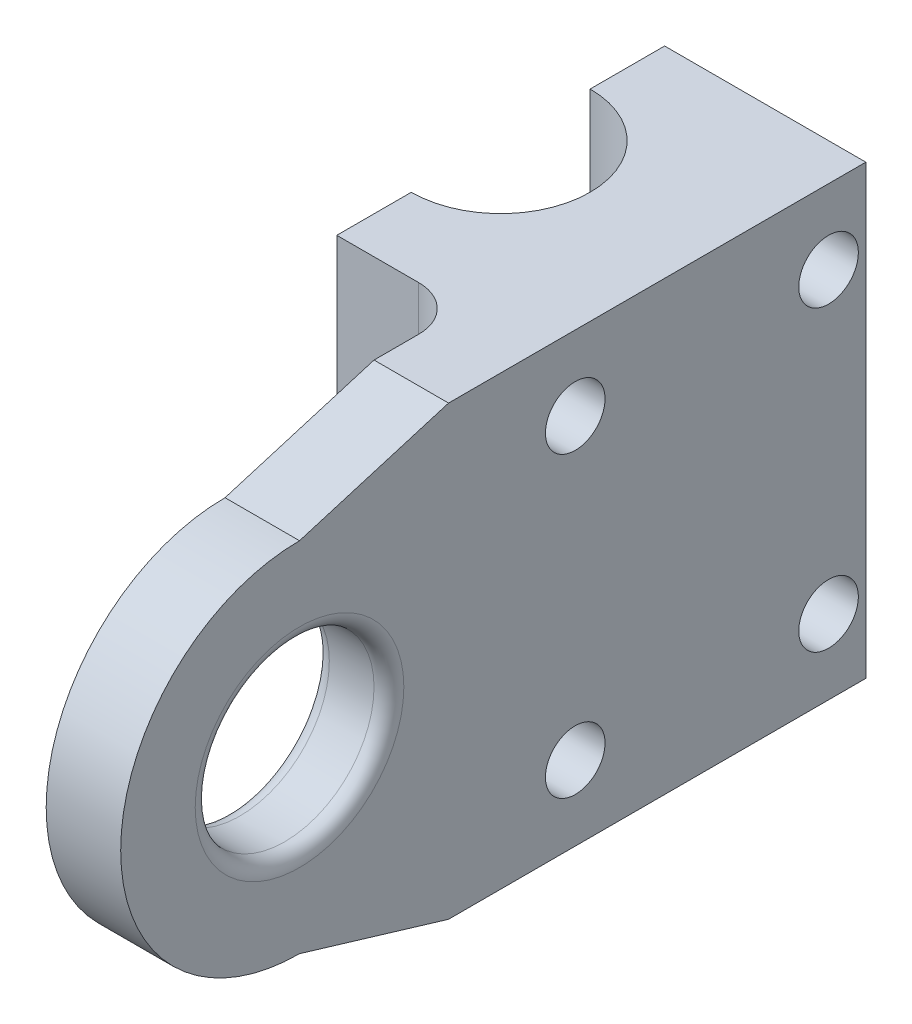
ISO-10303-21;
HEADER;
FILE_DESCRIPTION(('STEP AP214'),'2;1');
FILE_NAME('part.step','',(''),(''),'','','');
FILE_SCHEMA(('AUTOMOTIVE_DESIGN { 1 0 10303 214 1 1 1 1 }'));
ENDSEC;
DATA;
#1=APPLICATION_CONTEXT('core data for automotive mechanical design processes');
#2=APPLICATION_PROTOCOL_DEFINITION('international standard','automotive_design',2000,#1);
#3=PRODUCT_CONTEXT('',#1,'mechanical');
#4=PRODUCT('Part','Part','',(#3));
#5=PRODUCT_RELATED_PRODUCT_CATEGORY('part','',(#4));
#6=PRODUCT_DEFINITION_FORMATION('','',#4);
#7=PRODUCT_DEFINITION_CONTEXT('part definition',#1,'design');
#8=PRODUCT_DEFINITION('design','',#6,#7);
#9=PRODUCT_DEFINITION_SHAPE('','',#8);
#10=(LENGTH_UNIT() NAMED_UNIT(*) SI_UNIT(.MILLI.,.METRE.));
#11=(NAMED_UNIT(*) PLANE_ANGLE_UNIT() SI_UNIT($,.RADIAN.));
#12=(NAMED_UNIT(*) SI_UNIT($,.STERADIAN.) SOLID_ANGLE_UNIT());
#13=UNCERTAINTY_MEASURE_WITH_UNIT(LENGTH_MEASURE(1.E-05),#10,'distance_accuracy_value','');
#14=(GEOMETRIC_REPRESENTATION_CONTEXT(3) GLOBAL_UNCERTAINTY_ASSIGNED_CONTEXT((#13)) GLOBAL_UNIT_ASSIGNED_CONTEXT((#10,
#11,#12)) REPRESENTATION_CONTEXT('',''));
#15=CARTESIAN_POINT('',(0.,0.,0.));
#16=DIRECTION('',(0.,0.,1.));
#17=DIRECTION('',(1.,0.,0.));
#18=AXIS2_PLACEMENT_3D('',#15,#16,#17);
#19=CARTESIAN_POINT('',(8.5,30.,0.));
#20=DIRECTION('',(1.,0.,0.));
#21=DIRECTION('',(0.,0.,-1.));
#22=AXIS2_PLACEMENT_3D('',#19,#20,#21);
#23=PLANE('',#22);
#24=CARTESIAN_POINT('',(8.5,15.,-12.));
#25=DIRECTION('',(1.,0.,0.));
#26=DIRECTION('',(0.,0.,-1.));
#27=AXIS2_PLACEMENT_3D('',#24,#25,#26);
#28=CIRCLE('',#27,7.);
#29=CARTESIAN_POINT('',(8.5,15.,-19.));
#30=VERTEX_POINT('',#29);
#31=EDGE_CURVE('E12',#30,#30,#28,.T.);
#32=ORIENTED_EDGE('',*,*,#31,.T.);
#33=EDGE_LOOP('',(#32));
#34=FACE_BOUND('',#33,.T.);
#35=CARTESIAN_POINT('',(8.5,15.,-12.));
#36=DIRECTION('',(1.,0.,0.));
#37=DIRECTION('',(0.,0.,-1.));
#38=AXIS2_PLACEMENT_3D('',#35,#36,#37);
#39=CIRCLE('',#38,12.);
#40=CARTESIAN_POINT('',(8.5,3.,-12.));
#41=VERTEX_POINT('',#40);
#42=CARTESIAN_POINT('',(8.5,27.,-12.));
#43=VERTEX_POINT('',#42);
#44=EDGE_CURVE('E334',#41,#43,#39,.F.);
#45=ORIENTED_EDGE('',*,*,#44,.T.);
#46=DIRECTION('',(0.,-0.287347885566346,0.957826285221151));
#47=VECTOR('',#46,1.);
#48=CARTESIAN_POINT('',(8.5,21.4678899082569,6.44036697247707));
#49=LINE('',#48,#47);
#50=CARTESIAN_POINT('',(8.5,30.,-22.));
#51=VERTEX_POINT('',#50);
#52=EDGE_CURVE('E202',#51,#43,#49,.T.);
#53=ORIENTED_EDGE('',*,*,#52,.F.);
#54=DIRECTION('',(0.,0.,1.));
#55=VECTOR('',#54,1.);
#56=CARTESIAN_POINT('',(8.5,30.,0.));
#57=LINE('',#56,#55);
#58=CARTESIAN_POINT('',(8.5,30.,-25.));
#59=VERTEX_POINT('',#58);
#60=EDGE_CURVE('E181',#59,#51,#57,.T.);
#61=ORIENTED_EDGE('',*,*,#60,.F.);
#62=DIRECTION('',(0.,-1.,0.));
#63=VECTOR('',#62,1.);
#64=CARTESIAN_POINT('',(8.5,30.,-25.));
#65=LINE('',#64,#63);
#66=CARTESIAN_POINT('',(8.5,0.,-25.));
#67=VERTEX_POINT('',#66);
#68=EDGE_CURVE('E189',#59,#67,#65,.T.);
#69=ORIENTED_EDGE('',*,*,#68,.T.);
#70=DIRECTION('',(0.,0.,1.));
#71=VECTOR('',#70,1.);
#72=CARTESIAN_POINT('',(8.5,0.,0.));
#73=LINE('',#72,#71);
#74=CARTESIAN_POINT('',(8.5,0.,-22.));
#75=VERTEX_POINT('',#74);
#76=EDGE_CURVE('E221',#67,#75,#73,.T.);
#77=ORIENTED_EDGE('',*,*,#76,.T.);
#78=DIRECTION('',(0.,-0.287347885566346,-0.957826285221151));
#79=VECTOR('',#78,1.);
#80=CARTESIAN_POINT('',(8.5,6.05504587155964,-1.81651376146789));
#81=LINE('',#80,#79);
#82=EDGE_CURVE('E114',#41,#75,#81,.T.);
#83=ORIENTED_EDGE('',*,*,#82,.F.);
#84=EDGE_LOOP('',(#45,#53,#61,#69,#77,#83));
#85=FACE_BOUND('',#84,.T.);
#86=ADVANCED_FACE('F99',(#34,#85),#23,.F.);
#87=CARTESIAN_POINT('',(13.5,30.,-50.));
#88=DIRECTION('',(-1.,0.,0.));
#89=DIRECTION('',(0.,0.,1.));
#90=AXIS2_PLACEMENT_3D('',#87,#88,#89);
#91=PLANE('',#90);
#92=CARTESIAN_POINT('',(13.5,15.,-12.));
#93=DIRECTION('',(-1.,0.,0.));
#94=DIRECTION('',(0.,0.,1.));
#95=AXIS2_PLACEMENT_3D('',#92,#93,#94);
#96=CIRCLE('',#95,7.);
#97=CARTESIAN_POINT('',(13.5,15.,-5.));
#98=VERTEX_POINT('',#97);
#99=EDGE_CURVE('E107',#98,#98,#96,.T.);
#100=ORIENTED_EDGE('',*,*,#99,.T.);
#101=EDGE_LOOP('',(#100));
#102=FACE_BOUND('',#101,.T.);
#103=CARTESIAN_POINT('',(13.5,25.,-47.5));
#104=DIRECTION('',(1.,0.,0.));
#105=DIRECTION('',(0.,0.,-1.));
#106=AXIS2_PLACEMENT_3D('',#103,#104,#105);
#107=CIRCLE('',#106,2.);
#108=CARTESIAN_POINT('',(13.5,25.,-49.5));
#109=VERTEX_POINT('',#108);
#110=EDGE_CURVE('E305',#109,#109,#107,.T.);
#111=ORIENTED_EDGE('',*,*,#110,.F.);
#112=EDGE_LOOP('',(#111));
#113=FACE_BOUND('',#112,.T.);
#114=CARTESIAN_POINT('',(13.5,25.,-30.5));
#115=DIRECTION('',(1.,0.,0.));
#116=DIRECTION('',(0.,0.,-1.));
#117=AXIS2_PLACEMENT_3D('',#114,#115,#116);
#118=CIRCLE('',#117,2.);
#119=CARTESIAN_POINT('',(13.5,25.,-32.5));
#120=VERTEX_POINT('',#119);
#121=EDGE_CURVE('E311',#120,#120,#118,.T.);
#122=ORIENTED_EDGE('',*,*,#121,.F.);
#123=EDGE_LOOP('',(#122));
#124=FACE_BOUND('',#123,.T.);
#125=CARTESIAN_POINT('',(13.5,4.99999999999999,-30.5));
#126=DIRECTION('',(1.,0.,0.));
#127=DIRECTION('',(0.,0.,-1.));
#128=AXIS2_PLACEMENT_3D('',#125,#126,#127);
#129=CIRCLE('',#128,2.);
#130=CARTESIAN_POINT('',(13.5,4.99999999999999,-32.5));
#131=VERTEX_POINT('',#130);
#132=EDGE_CURVE('E315',#131,#131,#129,.F.);
#133=ORIENTED_EDGE('',*,*,#132,.T.);
#134=EDGE_LOOP('',(#133));
#135=FACE_BOUND('',#134,.T.);
#136=CARTESIAN_POINT('',(13.5,5.,-47.5));
#137=DIRECTION('',(1.,0.,0.));
#138=DIRECTION('',(0.,0.,-1.));
#139=AXIS2_PLACEMENT_3D('',#136,#137,#138);
#140=CIRCLE('',#139,2.);
#141=CARTESIAN_POINT('',(13.5,5.,-49.5));
#142=VERTEX_POINT('',#141);
#143=EDGE_CURVE('E316',#142,#142,#140,.F.);
#144=ORIENTED_EDGE('',*,*,#143,.T.);
#145=EDGE_LOOP('',(#144));
#146=FACE_BOUND('',#145,.T.);
#147=DIRECTION('',(0.,0.287347885566346,-0.957826285221151));
#148=VECTOR('',#147,1.);
#149=CARTESIAN_POINT('',(13.5,21.4678899082569,6.44036697247706));
#150=LINE('',#149,#148);
#151=CARTESIAN_POINT('',(13.5,27.,-12.));
#152=VERTEX_POINT('',#151);
#153=CARTESIAN_POINT('',(13.5,30.,-22.));
#154=VERTEX_POINT('',#153);
#155=EDGE_CURVE('E325',#152,#154,#150,.T.);
#156=ORIENTED_EDGE('',*,*,#155,.F.);
#157=CARTESIAN_POINT('',(13.5,15.,-12.));
#158=DIRECTION('',(1.,0.,0.));
#159=DIRECTION('',(0.,0.,-1.));
#160=AXIS2_PLACEMENT_3D('',#157,#158,#159);
#161=CIRCLE('',#160,12.);
#162=CARTESIAN_POINT('',(13.5,3.,-12.));
#163=VERTEX_POINT('',#162);
#164=EDGE_CURVE('E336',#152,#163,#161,.T.);
#165=ORIENTED_EDGE('',*,*,#164,.T.);
#166=DIRECTION('',(0.,0.287347885566346,0.957826285221151));
#167=VECTOR('',#166,1.);
#168=CARTESIAN_POINT('',(13.5,6.05504587155964,-1.8165137614679));
#169=LINE('',#168,#167);
#170=CARTESIAN_POINT('',(13.5,0.,-22.));
#171=VERTEX_POINT('',#170);
#172=EDGE_CURVE('E339',#171,#163,#169,.T.);
#173=ORIENTED_EDGE('',*,*,#172,.F.);
#174=DIRECTION('',(0.,0.,-1.));
#175=VECTOR('',#174,1.);
#176=CARTESIAN_POINT('',(13.5,0.,-50.));
#177=LINE('',#176,#175);
#178=CARTESIAN_POINT('',(13.5,0.,-50.));
#179=VERTEX_POINT('',#178);
#180=EDGE_CURVE('E223',#171,#179,#177,.T.);
#181=ORIENTED_EDGE('',*,*,#180,.T.);
#182=DIRECTION('',(0.,-1.,0.));
#183=VECTOR('',#182,1.);
#184=CARTESIAN_POINT('',(13.5,30.,-50.));
#185=LINE('',#184,#183);
#186=CARTESIAN_POINT('',(13.5,30.,-50.));
#187=VERTEX_POINT('',#186);
#188=EDGE_CURVE('E197',#187,#179,#185,.T.);
#189=ORIENTED_EDGE('',*,*,#188,.F.);
#190=DIRECTION('',(0.,0.,-1.));
#191=VECTOR('',#190,1.);
#192=CARTESIAN_POINT('',(13.5,30.,-50.));
#193=LINE('',#192,#191);
#194=EDGE_CURVE('E203',#154,#187,#193,.T.);
#195=ORIENTED_EDGE('',*,*,#194,.F.);
#196=EDGE_LOOP('',(#156,#165,#173,#181,#189,#195));
#197=FACE_BOUND('',#196,.T.);
#198=ADVANCED_FACE('F246',(#102,#113,#124,#135,#146,#197),#91,.F.);
#199=CARTESIAN_POINT('',(0.,30.,-45.));
#200=DIRECTION('',(1.,0.,0.));
#201=DIRECTION('',(0.,0.,-1.));
#202=AXIS2_PLACEMENT_3D('',#199,#200,#201);
#203=PLANE('',#202);
#204=DIRECTION('',(0.,0.,1.));
#205=VECTOR('',#204,1.);
#206=CARTESIAN_POINT('',(0.,0.,-45.));
#207=LINE('',#206,#205);
#208=CARTESIAN_POINT('',(0.,0.,-50.));
#209=VERTEX_POINT('',#208);
#210=CARTESIAN_POINT('',(0.,0.,-45.));
#211=VERTEX_POINT('',#210);
#212=EDGE_CURVE('E210',#209,#211,#207,.T.);
#213=ORIENTED_EDGE('',*,*,#212,.T.);
#214=DIRECTION('',(0.,-1.,0.));
#215=VECTOR('',#214,1.);
#216=CARTESIAN_POINT('',(0.,30.,-45.));
#217=LINE('',#216,#215);
#218=CARTESIAN_POINT('',(0.,30.,-45.));
#219=VERTEX_POINT('',#218);
#220=EDGE_CURVE('E236',#219,#211,#217,.T.);
#221=ORIENTED_EDGE('',*,*,#220,.F.);
#222=DIRECTION('',(0.,0.,1.));
#223=VECTOR('',#222,1.);
#224=CARTESIAN_POINT('',(0.,30.,-45.));
#225=LINE('',#224,#223);
#226=CARTESIAN_POINT('',(0.,30.,-50.));
#227=VERTEX_POINT('',#226);
#228=EDGE_CURVE('E226',#227,#219,#225,.T.);
#229=ORIENTED_EDGE('',*,*,#228,.F.);
#230=DIRECTION('',(0.,-1.,0.));
#231=VECTOR('',#230,1.);
#232=CARTESIAN_POINT('',(0.,30.,-50.));
#233=LINE('',#232,#231);
#234=EDGE_CURVE('E209',#227,#209,#233,.T.);
#235=ORIENTED_EDGE('',*,*,#234,.T.);
#236=EDGE_LOOP('',(#213,#221,#229,#235));
#237=FACE_BOUND('',#236,.T.);
#238=CARTESIAN_POINT('',(0.,5.,-47.5));
#239=DIRECTION('',(1.,0.,0.));
#240=DIRECTION('',(0.,0.,-1.));
#241=AXIS2_PLACEMENT_3D('',#238,#239,#240);
#242=CIRCLE('',#241,2.);
#243=CARTESIAN_POINT('',(0.,5.,-49.5));
#244=VERTEX_POINT('',#243);
#245=EDGE_CURVE('E300',#244,#244,#242,.T.);
#246=ORIENTED_EDGE('',*,*,#245,.T.);
#247=EDGE_LOOP('',(#246));
#248=FACE_BOUND('',#247,.T.);
#249=CARTESIAN_POINT('',(0.,25.,-47.5));
#250=DIRECTION('',(1.,0.,0.));
#251=DIRECTION('',(0.,0.,-1.));
#252=AXIS2_PLACEMENT_3D('',#249,#250,#251);
#253=CIRCLE('',#252,2.);
#254=CARTESIAN_POINT('',(0.,25.,-49.5));
#255=VERTEX_POINT('',#254);
#256=EDGE_CURVE('E303',#255,#255,#253,.F.);
#257=ORIENTED_EDGE('',*,*,#256,.F.);
#258=EDGE_LOOP('',(#257));
#259=FACE_BOUND('',#258,.T.);
#260=ADVANCED_FACE('F272',(#237,#248,#259),#203,.F.);
#261=CARTESIAN_POINT('',(0.,30.,-28.));
#262=DIRECTION('',(1.,0.,0.));
#263=DIRECTION('',(0.,0.,-1.));
#264=AXIS2_PLACEMENT_3D('',#261,#262,#263);
#265=PLANE('',#264);
#266=DIRECTION('',(0.,0.,1.));
#267=VECTOR('',#266,1.);
#268=CARTESIAN_POINT('',(0.,0.,-28.));
#269=LINE('',#268,#267);
#270=CARTESIAN_POINT('',(0.,0.,-33.));
#271=VERTEX_POINT('',#270);
#272=CARTESIAN_POINT('',(0.,0.,-28.));
#273=VERTEX_POINT('',#272);
#274=EDGE_CURVE('E216',#271,#273,#269,.T.);
#275=ORIENTED_EDGE('',*,*,#274,.T.);
#276=DIRECTION('',(0.,-1.,0.));
#277=VECTOR('',#276,1.);
#278=CARTESIAN_POINT('',(0.,30.,-28.));
#279=LINE('',#278,#277);
#280=CARTESIAN_POINT('',(0.,30.,-28.));
#281=VERTEX_POINT('',#280);
#282=EDGE_CURVE('E230',#281,#273,#279,.T.);
#283=ORIENTED_EDGE('',*,*,#282,.F.);
#284=DIRECTION('',(0.,0.,1.));
#285=VECTOR('',#284,1.);
#286=CARTESIAN_POINT('',(0.,30.,-28.));
#287=LINE('',#286,#285);
#288=CARTESIAN_POINT('',(0.,30.,-33.));
#289=VERTEX_POINT('',#288);
#290=EDGE_CURVE('E348',#289,#281,#287,.T.);
#291=ORIENTED_EDGE('',*,*,#290,.F.);
#292=DIRECTION('',(0.,-1.,0.));
#293=VECTOR('',#292,1.);
#294=CARTESIAN_POINT('',(0.,30.,-33.));
#295=LINE('',#294,#293);
#296=EDGE_CURVE('E233',#289,#271,#295,.T.);
#297=ORIENTED_EDGE('',*,*,#296,.T.);
#298=EDGE_LOOP('',(#275,#283,#291,#297));
#299=FACE_BOUND('',#298,.T.);
#300=CARTESIAN_POINT('',(0.,4.99999999999999,-30.5));
#301=DIRECTION('',(1.,0.,0.));
#302=DIRECTION('',(0.,0.,-1.));
#303=AXIS2_PLACEMENT_3D('',#300,#301,#302);
#304=CIRCLE('',#303,2.);
#305=CARTESIAN_POINT('',(0.,4.99999999999999,-32.5));
#306=VERTEX_POINT('',#305);
#307=EDGE_CURVE('E321',#306,#306,#304,.T.);
#308=ORIENTED_EDGE('',*,*,#307,.T.);
#309=EDGE_LOOP('',(#308));
#310=FACE_BOUND('',#309,.T.);
#311=CARTESIAN_POINT('',(0.,25.,-30.5));
#312=DIRECTION('',(1.,0.,0.));
#313=DIRECTION('',(0.,0.,-1.));
#314=AXIS2_PLACEMENT_3D('',#311,#312,#313);
#315=CIRCLE('',#314,2.);
#316=CARTESIAN_POINT('',(0.,25.,-32.5));
#317=VERTEX_POINT('',#316);
#318=EDGE_CURVE('E308',#317,#317,#315,.F.);
#319=ORIENTED_EDGE('',*,*,#318,.F.);
#320=EDGE_LOOP('',(#319));
#321=FACE_BOUND('',#320,.T.);
#322=ADVANCED_FACE('F284',(#299,#310,#321),#265,.F.);
#323=CARTESIAN_POINT('',(0.,30.,-39.));
#324=DIRECTION('',(0.,-1.,0.));
#325=DIRECTION('',(0.,0.,-1.));
#326=AXIS2_PLACEMENT_3D('',#323,#324,#325);
#327=CYLINDRICAL_SURFACE('',#326,6.);
#328=CARTESIAN_POINT('',(0.,0.,-39.));
#329=DIRECTION('',(0.,-1.,0.));
#330=DIRECTION('',(0.,0.,1.));
#331=AXIS2_PLACEMENT_3D('',#328,#329,#330);
#332=CIRCLE('',#331,6.);
#333=EDGE_CURVE('E213',#211,#271,#332,.T.);
#334=ORIENTED_EDGE('',*,*,#333,.T.);
#335=ORIENTED_EDGE('',*,*,#296,.F.);
#336=CARTESIAN_POINT('',(0.,30.,-39.));
#337=DIRECTION('',(0.,-1.,0.));
#338=DIRECTION('',(0.,0.,1.));
#339=AXIS2_PLACEMENT_3D('',#336,#337,#338);
#340=CIRCLE('',#339,6.);
#341=EDGE_CURVE('E162',#219,#289,#340,.T.);
#342=ORIENTED_EDGE('',*,*,#341,.F.);
#343=ORIENTED_EDGE('',*,*,#220,.T.);
#344=EDGE_LOOP('',(#334,#335,#342,#343));
#345=FACE_BOUND('',#344,.T.);
#346=ADVANCED_FACE('F282',(#345),#327,.F.);
#347=CARTESIAN_POINT('',(5.5,30.,-28.));
#348=DIRECTION('',(0.,0.,-1.));
#349=DIRECTION('',(-1.,0.,0.));
#350=AXIS2_PLACEMENT_3D('',#347,#348,#349);
#351=PLANE('',#350);
#352=DIRECTION('',(1.,0.,0.));
#353=VECTOR('',#352,1.);
#354=CARTESIAN_POINT('',(5.5,0.,-28.));
#355=LINE('',#354,#353);
#356=CARTESIAN_POINT('',(5.5,0.,-28.));
#357=VERTEX_POINT('',#356);
#358=EDGE_CURVE('E218',#273,#357,#355,.T.);
#359=ORIENTED_EDGE('',*,*,#358,.T.);
#360=DIRECTION('',(0.,-1.,0.));
#361=VECTOR('',#360,1.);
#362=CARTESIAN_POINT('',(5.5,30.,-28.));
#363=LINE('',#362,#361);
#364=CARTESIAN_POINT('',(5.5,30.,-28.));
#365=VERTEX_POINT('',#364);
#366=EDGE_CURVE('E196',#365,#357,#363,.T.);
#367=ORIENTED_EDGE('',*,*,#366,.F.);
#368=DIRECTION('',(1.,0.,0.));
#369=VECTOR('',#368,1.);
#370=CARTESIAN_POINT('',(5.5,30.,-28.));
#371=LINE('',#370,#369);
#372=EDGE_CURVE('E183',#281,#365,#371,.T.);
#373=ORIENTED_EDGE('',*,*,#372,.F.);
#374=ORIENTED_EDGE('',*,*,#282,.T.);
#375=EDGE_LOOP('',(#359,#367,#373,#374));
#376=FACE_BOUND('',#375,.T.);
#377=ADVANCED_FACE('F279',(#376),#351,.F.);
#378=CARTESIAN_POINT('',(5.5,30.,-25.));
#379=DIRECTION('',(0.,-1.,0.));
#380=DIRECTION('',(0.,0.,-1.));
#381=AXIS2_PLACEMENT_3D('',#378,#379,#380);
#382=CYLINDRICAL_SURFACE('',#381,3.);
#383=CARTESIAN_POINT('',(5.5,0.,-25.));
#384=DIRECTION('',(0.,-1.,0.));
#385=DIRECTION('',(0.,0.,1.));
#386=AXIS2_PLACEMENT_3D('',#383,#384,#385);
#387=CIRCLE('',#386,3.);
#388=EDGE_CURVE('E192',#357,#67,#387,.T.);
#389=ORIENTED_EDGE('',*,*,#388,.T.);
#390=ORIENTED_EDGE('',*,*,#68,.F.);
#391=CARTESIAN_POINT('',(5.5,30.,-25.));
#392=DIRECTION('',(0.,-1.,0.));
#393=DIRECTION('',(0.,0.,1.));
#394=AXIS2_PLACEMENT_3D('',#391,#392,#393);
#395=CIRCLE('',#394,3.);
#396=EDGE_CURVE('E175',#365,#59,#395,.T.);
#397=ORIENTED_EDGE('',*,*,#396,.F.);
#398=ORIENTED_EDGE('',*,*,#366,.T.);
#399=EDGE_LOOP('',(#389,#390,#397,#398));
#400=FACE_BOUND('',#399,.T.);
#401=ADVANCED_FACE('F190',(#400),#382,.F.);
#402=CARTESIAN_POINT('',(0.,30.,-50.));
#403=DIRECTION('',(0.,0.,1.));
#404=DIRECTION('',(1.,0.,0.));
#405=AXIS2_PLACEMENT_3D('',#402,#403,#404);
#406=PLANE('',#405);
#407=DIRECTION('',(-1.,0.,0.));
#408=VECTOR('',#407,1.);
#409=CARTESIAN_POINT('',(0.,0.,-50.));
#410=LINE('',#409,#408);
#411=EDGE_CURVE('E153',#179,#209,#410,.T.);
#412=ORIENTED_EDGE('',*,*,#411,.T.);
#413=ORIENTED_EDGE('',*,*,#234,.F.);
#414=DIRECTION('',(-1.,0.,0.));
#415=VECTOR('',#414,1.);
#416=CARTESIAN_POINT('',(0.,30.,-50.));
#417=LINE('',#416,#415);
#418=EDGE_CURVE('E123',#187,#227,#417,.T.);
#419=ORIENTED_EDGE('',*,*,#418,.F.);
#420=ORIENTED_EDGE('',*,*,#188,.T.);
#421=EDGE_LOOP('',(#412,#413,#419,#420));
#422=FACE_BOUND('',#421,.T.);
#423=ADVANCED_FACE('F278',(#422),#406,.F.);
#424=CARTESIAN_POINT('',(5.5,30.,-25.));
#425=DIRECTION('',(0.,1.,0.));
#426=DIRECTION('',(0.,0.,1.));
#427=AXIS2_PLACEMENT_3D('',#424,#425,#426);
#428=PLANE('',#427);
#429=DIRECTION('',(1.,0.,0.));
#430=VECTOR('',#429,1.);
#431=CARTESIAN_POINT('',(-0.00100000000000273,30.,-22.));
#432=LINE('',#431,#430);
#433=EDGE_CURVE('E320',#51,#154,#432,.T.);
#434=ORIENTED_EDGE('',*,*,#433,.T.);
#435=ORIENTED_EDGE('',*,*,#194,.T.);
#436=ORIENTED_EDGE('',*,*,#418,.T.);
#437=ORIENTED_EDGE('',*,*,#228,.T.);
#438=ORIENTED_EDGE('',*,*,#341,.T.);
#439=ORIENTED_EDGE('',*,*,#290,.T.);
#440=ORIENTED_EDGE('',*,*,#372,.T.);
#441=ORIENTED_EDGE('',*,*,#396,.T.);
#442=ORIENTED_EDGE('',*,*,#60,.T.);
#443=EDGE_LOOP('',(#434,#435,#436,#437,#438,#439,#440,#441,#442));
#444=FACE_BOUND('',#443,.T.);
#445=ADVANCED_FACE('F178',(#444),#428,.T.);
#446=CARTESIAN_POINT('',(5.5,0.,-25.));
#447=DIRECTION('',(0.,1.,0.));
#448=DIRECTION('',(0.,0.,1.));
#449=AXIS2_PLACEMENT_3D('',#446,#447,#448);
#450=PLANE('',#449);
#451=ORIENTED_EDGE('',*,*,#180,.F.);
#452=DIRECTION('',(1.,0.,0.));
#453=VECTOR('',#452,1.);
#454=CARTESIAN_POINT('',(-0.00100000000000273,0.,-22.));
#455=LINE('',#454,#453);
#456=EDGE_CURVE('E342',#75,#171,#455,.T.);
#457=ORIENTED_EDGE('',*,*,#456,.F.);
#458=ORIENTED_EDGE('',*,*,#76,.F.);
#459=ORIENTED_EDGE('',*,*,#388,.F.);
#460=ORIENTED_EDGE('',*,*,#358,.F.);
#461=ORIENTED_EDGE('',*,*,#274,.F.);
#462=ORIENTED_EDGE('',*,*,#333,.F.);
#463=ORIENTED_EDGE('',*,*,#212,.F.);
#464=ORIENTED_EDGE('',*,*,#411,.F.);
#465=EDGE_LOOP('',(#451,#457,#458,#459,#460,#461,#462,#463,#464));
#466=FACE_BOUND('',#465,.T.);
#467=ADVANCED_FACE('F356',(#466),#450,.F.);
#468=CARTESIAN_POINT('',(-0.001000000000001,15.,-12.));
#469=DIRECTION('',(1.,0.,0.));
#470=DIRECTION('',(0.,0.,-1.));
#471=AXIS2_PLACEMENT_3D('',#468,#469,#470);
#472=CYLINDRICAL_SURFACE('',#471,12.);
#473=DIRECTION('',(1.,0.,0.));
#474=VECTOR('',#473,1.);
#475=CARTESIAN_POINT('',(-0.001000000000001,3.,-12.));
#476=LINE('',#475,#474);
#477=EDGE_CURVE('E214',#41,#163,#476,.T.);
#478=ORIENTED_EDGE('',*,*,#477,.T.);
#479=ORIENTED_EDGE('',*,*,#164,.F.);
#480=DIRECTION('',(1.,0.,0.));
#481=VECTOR('',#480,1.);
#482=CARTESIAN_POINT('',(-0.001000000000001,27.,-12.));
#483=LINE('',#482,#481);
#484=EDGE_CURVE('E322',#43,#152,#483,.T.);
#485=ORIENTED_EDGE('',*,*,#484,.F.);
#486=ORIENTED_EDGE('',*,*,#44,.F.);
#487=EDGE_LOOP('',(#478,#479,#485,#486));
#488=FACE_BOUND('',#487,.T.);
#489=ADVANCED_FACE('F387',(#488),#472,.T.);
#490=CARTESIAN_POINT('',(-0.000999999999999265,6.05504587155964,-1.81651376146789));
#491=DIRECTION('',(0.,0.957826285221151,-0.287347885566346));
#492=DIRECTION('',(0.,0.287347885566346,0.957826285221151));
#493=AXIS2_PLACEMENT_3D('',#490,#491,#492);
#494=PLANE('',#493);
#495=ORIENTED_EDGE('',*,*,#82,.T.);
#496=ORIENTED_EDGE('',*,*,#456,.T.);
#497=ORIENTED_EDGE('',*,*,#172,.T.);
#498=ORIENTED_EDGE('',*,*,#477,.F.);
#499=EDGE_LOOP('',(#495,#496,#497,#498));
#500=FACE_BOUND('',#499,.T.);
#501=ADVANCED_FACE('F388',(#500),#494,.F.);
#502=CARTESIAN_POINT('',(-0.000999999999997531,21.4678899082569,6.44036697247707));
#503=DIRECTION('',(0.,-0.957826285221151,-0.287347885566346));
#504=DIRECTION('',(0.,0.287347885566346,-0.957826285221151));
#505=AXIS2_PLACEMENT_3D('',#502,#503,#504);
#506=PLANE('',#505);
#507=ORIENTED_EDGE('',*,*,#52,.T.);
#508=ORIENTED_EDGE('',*,*,#484,.T.);
#509=ORIENTED_EDGE('',*,*,#155,.T.);
#510=ORIENTED_EDGE('',*,*,#433,.F.);
#511=EDGE_LOOP('',(#507,#508,#509,#510));
#512=FACE_BOUND('',#511,.T.);
#513=ADVANCED_FACE('F373',(#512),#506,.F.);
#514=CARTESIAN_POINT('',(-0.00100000000000447,4.99999999999999,-30.5));
#515=DIRECTION('',(1.,0.,0.));
#516=DIRECTION('',(0.,0.,-1.));
#517=AXIS2_PLACEMENT_3D('',#514,#515,#516);
#518=CYLINDRICAL_SURFACE('',#517,2.);
#519=CARTESIAN_POINT('',(13.5,4.99999999999999,-32.5));
#520=CARTESIAN_POINT('',(13.359375,4.99999999999999,-32.5));
#521=CARTESIAN_POINT('',(13.21875,4.99999999999999,-32.5));
#522=CARTESIAN_POINT('',(12.9375,4.99999999999999,-32.5));
#523=CARTESIAN_POINT('',(12.796875,4.99999999999999,-32.5));
#524=CARTESIAN_POINT('',(12.515625,4.99999999999999,-32.5));
#525=CARTESIAN_POINT('',(12.375,4.99999999999999,-32.5));
#526=CARTESIAN_POINT('',(12.09375,4.99999999999999,-32.5));
#527=CARTESIAN_POINT('',(11.953125,4.99999999999999,-32.5));
#528=CARTESIAN_POINT('',(11.671875,4.99999999999999,-32.5));
#529=CARTESIAN_POINT('',(11.53125,4.99999999999999,-32.5));
#530=CARTESIAN_POINT('',(11.25,4.99999999999999,-32.5));
#531=CARTESIAN_POINT('',(11.109375,4.99999999999999,-32.5));
#532=CARTESIAN_POINT('',(10.828125,4.99999999999999,-32.5));
#533=CARTESIAN_POINT('',(10.6875,4.99999999999999,-32.5));
#534=CARTESIAN_POINT('',(10.40625,4.99999999999999,-32.5));
#535=CARTESIAN_POINT('',(10.265625,4.99999999999999,-32.5));
#536=CARTESIAN_POINT('',(9.984375,4.99999999999999,-32.5));
#537=CARTESIAN_POINT('',(9.84375,4.99999999999999,-32.5));
#538=CARTESIAN_POINT('',(9.5625,4.99999999999999,-32.5));
#539=CARTESIAN_POINT('',(9.421875,4.99999999999999,-32.5));
#540=CARTESIAN_POINT('',(9.140625,4.99999999999999,-32.5));
#541=CARTESIAN_POINT('',(9.,4.99999999999999,-32.5));
#542=CARTESIAN_POINT('',(8.71875,4.99999999999999,-32.5));
#543=CARTESIAN_POINT('',(8.578125,4.99999999999999,-32.5));
#544=CARTESIAN_POINT('',(8.296875,4.99999999999999,-32.5));
#545=CARTESIAN_POINT('',(8.15625,4.99999999999999,-32.5));
#546=CARTESIAN_POINT('',(7.875,4.99999999999999,-32.5));
#547=CARTESIAN_POINT('',(7.734375,4.99999999999999,-32.5));
#548=CARTESIAN_POINT('',(7.453125,4.99999999999999,-32.5));
#549=CARTESIAN_POINT('',(7.3125,4.99999999999999,-32.5));
#550=CARTESIAN_POINT('',(7.03125,4.99999999999999,-32.5));
#551=CARTESIAN_POINT('',(6.890625,4.99999999999999,-32.5));
#552=CARTESIAN_POINT('',(6.609375,4.99999999999999,-32.5));
#553=CARTESIAN_POINT('',(6.46875,4.99999999999999,-32.5));
#554=CARTESIAN_POINT('',(6.1875,4.99999999999999,-32.5));
#555=CARTESIAN_POINT('',(6.046875,4.99999999999999,-32.5));
#556=CARTESIAN_POINT('',(5.765625,4.99999999999999,-32.5));
#557=CARTESIAN_POINT('',(5.625,4.99999999999999,-32.5));
#558=CARTESIAN_POINT('',(5.34375,4.99999999999999,-32.5));
#559=CARTESIAN_POINT('',(5.203125,4.99999999999999,-32.5));
#560=CARTESIAN_POINT('',(4.921875,4.99999999999999,-32.5));
#561=CARTESIAN_POINT('',(4.78125,4.99999999999999,-32.5));
#562=CARTESIAN_POINT('',(4.5,4.99999999999999,-32.5));
#563=CARTESIAN_POINT('',(4.359375,4.99999999999999,-32.5));
#564=CARTESIAN_POINT('',(4.078125,4.99999999999999,-32.5));
#565=CARTESIAN_POINT('',(3.9375,4.99999999999999,-32.5));
#566=CARTESIAN_POINT('',(3.65625,4.99999999999999,-32.5));
#567=CARTESIAN_POINT('',(3.515625,4.99999999999999,-32.5));
#568=CARTESIAN_POINT('',(3.234375,4.99999999999999,-32.5));
#569=CARTESIAN_POINT('',(3.09375,4.99999999999999,-32.5));
#570=CARTESIAN_POINT('',(2.8125,4.99999999999999,-32.5));
#571=CARTESIAN_POINT('',(2.671875,4.99999999999999,-32.5));
#572=CARTESIAN_POINT('',(2.390625,4.99999999999999,-32.5));
#573=CARTESIAN_POINT('',(2.25,4.99999999999999,-32.5));
#574=CARTESIAN_POINT('',(1.96875,4.99999999999999,-32.5));
#575=CARTESIAN_POINT('',(1.828125,4.99999999999999,-32.5));
#576=CARTESIAN_POINT('',(1.546875,4.99999999999999,-32.5));
#577=CARTESIAN_POINT('',(1.40625,4.99999999999999,-32.5));
#578=CARTESIAN_POINT('',(1.125,4.99999999999999,-32.5));
#579=CARTESIAN_POINT('',(0.984375,4.99999999999999,-32.5));
#580=CARTESIAN_POINT('',(0.703125,4.99999999999999,-32.5));
#581=CARTESIAN_POINT('',(0.5625,4.99999999999999,-32.5));
#582=CARTESIAN_POINT('',(0.28125,4.99999999999999,-32.5));
#583=CARTESIAN_POINT('',(0.140625,4.99999999999999,-32.5));
#584=CARTESIAN_POINT('',(0.,4.99999999999999,-32.5));
#585=B_SPLINE_CURVE_WITH_KNOTS('',3,(#519,#520,#521,#522,#523,#524,#525,#526,#527,#528,#529,
#530,#531,#532,#533,#534,#535,#536,#537,#538,#539,#540,#541,#542,#543,#544,#545,#546,#547,#548,
#549,#550,#551,#552,#553,#554,#555,#556,#557,#558,#559,#560,#561,#562,#563,#564,#565,#566,#567,
#568,#569,#570,#571,#572,#573,#574,#575,#576,#577,#578,#579,#580,#581,#582,#583,#584),
.UNSPECIFIED.,.F.,.F.,(4,2,2,2,2,2,2,2,2,2,2,2,2,2,2,2,2,2,2,2,2,2,2,2,2,2,2,2,2,2,2,2,4),(0.,
0.421875,0.843750000000001,1.265625,1.6875,2.109375,2.53125,2.953125,3.375,3.796875,4.21875,
4.640625,5.0625,5.484375,5.90625,6.328125,6.75,7.171875,7.59375,8.015625,8.4375,8.859375,
9.28125,9.703125,10.125,10.546875,10.96875,11.390625,11.8125,12.234375,12.65625,13.078125,13.5),.UNSPECIFIED.);
#586=EDGE_CURVE('BSEAM394',#131,#306,#585,.T.);
#587=ORIENTED_EDGE('',*,*,#132,.F.);
#588=ORIENTED_EDGE('',*,*,#307,.F.);
#589=ORIENTED_EDGE('',*,*,#586,.T.);
#590=ORIENTED_EDGE('',*,*,#586,.F.);
#591=EDGE_LOOP('',(#587,#589,#588,#590));
#592=FACE_BOUND('',#591,.T.);
#593=ADVANCED_FACE('F394',(#592),#518,.F.);
#594=CARTESIAN_POINT('',(-0.00100000000000447,25.,-30.5));
#595=DIRECTION('',(1.,0.,0.));
#596=DIRECTION('',(0.,0.,-1.));
#597=AXIS2_PLACEMENT_3D('',#594,#595,#596);
#598=CYLINDRICAL_SURFACE('',#597,2.);
#599=CARTESIAN_POINT('',(13.5,25.,-32.5));
#600=CARTESIAN_POINT('',(13.359375,25.,-32.5));
#601=CARTESIAN_POINT('',(13.21875,25.,-32.5));
#602=CARTESIAN_POINT('',(12.9375,25.,-32.5));
#603=CARTESIAN_POINT('',(12.796875,25.,-32.5));
#604=CARTESIAN_POINT('',(12.515625,25.,-32.5));
#605=CARTESIAN_POINT('',(12.375,25.,-32.5));
#606=CARTESIAN_POINT('',(12.09375,25.,-32.5));
#607=CARTESIAN_POINT('',(11.953125,25.,-32.5));
#608=CARTESIAN_POINT('',(11.671875,25.,-32.5));
#609=CARTESIAN_POINT('',(11.53125,25.,-32.5));
#610=CARTESIAN_POINT('',(11.25,25.,-32.5));
#611=CARTESIAN_POINT('',(11.109375,25.,-32.5));
#612=CARTESIAN_POINT('',(10.828125,25.,-32.5));
#613=CARTESIAN_POINT('',(10.6875,25.,-32.5));
#614=CARTESIAN_POINT('',(10.40625,25.,-32.5));
#615=CARTESIAN_POINT('',(10.265625,25.,-32.5));
#616=CARTESIAN_POINT('',(9.984375,25.,-32.5));
#617=CARTESIAN_POINT('',(9.84375,25.,-32.5));
#618=CARTESIAN_POINT('',(9.5625,25.,-32.5));
#619=CARTESIAN_POINT('',(9.421875,25.,-32.5));
#620=CARTESIAN_POINT('',(9.140625,25.,-32.5));
#621=CARTESIAN_POINT('',(9.,25.,-32.5));
#622=CARTESIAN_POINT('',(8.71875,25.,-32.5));
#623=CARTESIAN_POINT('',(8.578125,25.,-32.5));
#624=CARTESIAN_POINT('',(8.296875,25.,-32.5));
#625=CARTESIAN_POINT('',(8.15625,25.,-32.5));
#626=CARTESIAN_POINT('',(7.875,25.,-32.5));
#627=CARTESIAN_POINT('',(7.734375,25.,-32.5));
#628=CARTESIAN_POINT('',(7.453125,25.,-32.5));
#629=CARTESIAN_POINT('',(7.3125,25.,-32.5));
#630=CARTESIAN_POINT('',(7.03125,25.,-32.5));
#631=CARTESIAN_POINT('',(6.890625,25.,-32.5));
#632=CARTESIAN_POINT('',(6.609375,25.,-32.5));
#633=CARTESIAN_POINT('',(6.46875,25.,-32.5));
#634=CARTESIAN_POINT('',(6.1875,25.,-32.5));
#635=CARTESIAN_POINT('',(6.046875,25.,-32.5));
#636=CARTESIAN_POINT('',(5.765625,25.,-32.5));
#637=CARTESIAN_POINT('',(5.625,25.,-32.5));
#638=CARTESIAN_POINT('',(5.34375,25.,-32.5));
#639=CARTESIAN_POINT('',(5.203125,25.,-32.5));
#640=CARTESIAN_POINT('',(4.921875,25.,-32.5));
#641=CARTESIAN_POINT('',(4.78125,25.,-32.5));
#642=CARTESIAN_POINT('',(4.5,25.,-32.5));
#643=CARTESIAN_POINT('',(4.359375,25.,-32.5));
#644=CARTESIAN_POINT('',(4.078125,25.,-32.5));
#645=CARTESIAN_POINT('',(3.9375,25.,-32.5));
#646=CARTESIAN_POINT('',(3.65625,25.,-32.5));
#647=CARTESIAN_POINT('',(3.515625,25.,-32.5));
#648=CARTESIAN_POINT('',(3.234375,25.,-32.5));
#649=CARTESIAN_POINT('',(3.09375,25.,-32.5));
#650=CARTESIAN_POINT('',(2.8125,25.,-32.5));
#651=CARTESIAN_POINT('',(2.671875,25.,-32.5));
#652=CARTESIAN_POINT('',(2.390625,25.,-32.5));
#653=CARTESIAN_POINT('',(2.25,25.,-32.5));
#654=CARTESIAN_POINT('',(1.96875,25.,-32.5));
#655=CARTESIAN_POINT('',(1.828125,25.,-32.5));
#656=CARTESIAN_POINT('',(1.546875,25.,-32.5));
#657=CARTESIAN_POINT('',(1.40625,25.,-32.5));
#658=CARTESIAN_POINT('',(1.125,25.,-32.5));
#659=CARTESIAN_POINT('',(0.984375,25.,-32.5));
#660=CARTESIAN_POINT('',(0.703125,25.,-32.5));
#661=CARTESIAN_POINT('',(0.5625,25.,-32.5));
#662=CARTESIAN_POINT('',(0.28125,25.,-32.5));
#663=CARTESIAN_POINT('',(0.140625,25.,-32.5));
#664=CARTESIAN_POINT('',(0.,25.,-32.5));
#665=B_SPLINE_CURVE_WITH_KNOTS('',3,(#599,#600,#601,#602,#603,#604,#605,#606,#607,#608,#609,
#610,#611,#612,#613,#614,#615,#616,#617,#618,#619,#620,#621,#622,#623,#624,#625,#626,#627,#628,
#629,#630,#631,#632,#633,#634,#635,#636,#637,#638,#639,#640,#641,#642,#643,#644,#645,#646,#647,
#648,#649,#650,#651,#652,#653,#654,#655,#656,#657,#658,#659,#660,#661,#662,#663,#664),
.UNSPECIFIED.,.F.,.F.,(4,2,2,2,2,2,2,2,2,2,2,2,2,2,2,2,2,2,2,2,2,2,2,2,2,2,2,2,2,2,2,2,4),(0.,
0.421875,0.843750000000001,1.265625,1.6875,2.109375,2.53125,2.953125,3.375,3.796875,4.21875,
4.640625,5.0625,5.484375,5.90625,6.328125,6.75,7.171875,7.59375,8.015625,8.4375,8.859375,
9.28125,9.703125,10.125,10.546875,10.96875,11.390625,11.8125,12.234375,12.65625,13.078125,13.5),.UNSPECIFIED.);
#666=EDGE_CURVE('BSEAM397',#120,#317,#665,.T.);
#667=ORIENTED_EDGE('',*,*,#121,.T.);
#668=ORIENTED_EDGE('',*,*,#318,.T.);
#669=ORIENTED_EDGE('',*,*,#666,.T.);
#670=ORIENTED_EDGE('',*,*,#666,.F.);
#671=EDGE_LOOP('',(#667,#669,#668,#670));
#672=FACE_BOUND('',#671,.T.);
#673=ADVANCED_FACE('F397',(#672),#598,.F.);
#674=CARTESIAN_POINT('',(-0.0010000000000062,5.,-47.5));
#675=DIRECTION('',(1.,0.,0.));
#676=DIRECTION('',(0.,0.,-1.));
#677=AXIS2_PLACEMENT_3D('',#674,#675,#676);
#678=CYLINDRICAL_SURFACE('',#677,2.);
#679=CARTESIAN_POINT('',(13.5,5.,-49.5));
#680=CARTESIAN_POINT('',(13.359375,5.,-49.5));
#681=CARTESIAN_POINT('',(13.21875,5.,-49.5));
#682=CARTESIAN_POINT('',(12.9375,5.,-49.5));
#683=CARTESIAN_POINT('',(12.796875,5.,-49.5));
#684=CARTESIAN_POINT('',(12.515625,5.,-49.5));
#685=CARTESIAN_POINT('',(12.375,5.,-49.5));
#686=CARTESIAN_POINT('',(12.09375,5.,-49.5));
#687=CARTESIAN_POINT('',(11.953125,5.,-49.5));
#688=CARTESIAN_POINT('',(11.671875,5.,-49.5));
#689=CARTESIAN_POINT('',(11.53125,5.,-49.5));
#690=CARTESIAN_POINT('',(11.25,5.,-49.5));
#691=CARTESIAN_POINT('',(11.109375,5.,-49.5));
#692=CARTESIAN_POINT('',(10.828125,5.,-49.5));
#693=CARTESIAN_POINT('',(10.6875,5.,-49.5));
#694=CARTESIAN_POINT('',(10.40625,5.,-49.5));
#695=CARTESIAN_POINT('',(10.265625,5.,-49.5));
#696=CARTESIAN_POINT('',(9.984375,5.,-49.5));
#697=CARTESIAN_POINT('',(9.84375,5.,-49.5));
#698=CARTESIAN_POINT('',(9.5625,5.,-49.5));
#699=CARTESIAN_POINT('',(9.421875,5.,-49.5));
#700=CARTESIAN_POINT('',(9.140625,5.,-49.5));
#701=CARTESIAN_POINT('',(9.,5.,-49.5));
#702=CARTESIAN_POINT('',(8.71875,5.,-49.5));
#703=CARTESIAN_POINT('',(8.578125,5.,-49.5));
#704=CARTESIAN_POINT('',(8.296875,5.,-49.5));
#705=CARTESIAN_POINT('',(8.15625,5.,-49.5));
#706=CARTESIAN_POINT('',(7.875,5.,-49.5));
#707=CARTESIAN_POINT('',(7.734375,5.,-49.5));
#708=CARTESIAN_POINT('',(7.453125,5.,-49.5));
#709=CARTESIAN_POINT('',(7.3125,5.,-49.5));
#710=CARTESIAN_POINT('',(7.03125,5.,-49.5));
#711=CARTESIAN_POINT('',(6.890625,5.,-49.5));
#712=CARTESIAN_POINT('',(6.609375,5.,-49.5));
#713=CARTESIAN_POINT('',(6.46875,5.,-49.5));
#714=CARTESIAN_POINT('',(6.1875,5.,-49.5));
#715=CARTESIAN_POINT('',(6.046875,5.,-49.5));
#716=CARTESIAN_POINT('',(5.765625,5.,-49.5));
#717=CARTESIAN_POINT('',(5.625,5.,-49.5));
#718=CARTESIAN_POINT('',(5.34375,5.,-49.5));
#719=CARTESIAN_POINT('',(5.203125,5.,-49.5));
#720=CARTESIAN_POINT('',(4.921875,5.,-49.5));
#721=CARTESIAN_POINT('',(4.78125,5.,-49.5));
#722=CARTESIAN_POINT('',(4.5,5.,-49.5));
#723=CARTESIAN_POINT('',(4.359375,5.,-49.5));
#724=CARTESIAN_POINT('',(4.078125,5.,-49.5));
#725=CARTESIAN_POINT('',(3.9375,5.,-49.5));
#726=CARTESIAN_POINT('',(3.65625,5.,-49.5));
#727=CARTESIAN_POINT('',(3.515625,5.,-49.5));
#728=CARTESIAN_POINT('',(3.234375,5.,-49.5));
#729=CARTESIAN_POINT('',(3.09375,5.,-49.5));
#730=CARTESIAN_POINT('',(2.8125,5.,-49.5));
#731=CARTESIAN_POINT('',(2.671875,5.,-49.5));
#732=CARTESIAN_POINT('',(2.390625,5.,-49.5));
#733=CARTESIAN_POINT('',(2.25,5.,-49.5));
#734=CARTESIAN_POINT('',(1.96875,5.,-49.5));
#735=CARTESIAN_POINT('',(1.828125,5.,-49.5));
#736=CARTESIAN_POINT('',(1.546875,5.,-49.5));
#737=CARTESIAN_POINT('',(1.40625,5.,-49.5));
#738=CARTESIAN_POINT('',(1.125,5.,-49.5));
#739=CARTESIAN_POINT('',(0.984375,5.,-49.5));
#740=CARTESIAN_POINT('',(0.703125,5.,-49.5));
#741=CARTESIAN_POINT('',(0.5625,5.,-49.5));
#742=CARTESIAN_POINT('',(0.28125,5.,-49.5));
#743=CARTESIAN_POINT('',(0.140625,5.,-49.5));
#744=CARTESIAN_POINT('',(0.,5.,-49.5));
#745=B_SPLINE_CURVE_WITH_KNOTS('',3,(#679,#680,#681,#682,#683,#684,#685,#686,#687,#688,#689,
#690,#691,#692,#693,#694,#695,#696,#697,#698,#699,#700,#701,#702,#703,#704,#705,#706,#707,#708,
#709,#710,#711,#712,#713,#714,#715,#716,#717,#718,#719,#720,#721,#722,#723,#724,#725,#726,#727,
#728,#729,#730,#731,#732,#733,#734,#735,#736,#737,#738,#739,#740,#741,#742,#743,#744),
.UNSPECIFIED.,.F.,.F.,(4,2,2,2,2,2,2,2,2,2,2,2,2,2,2,2,2,2,2,2,2,2,2,2,2,2,2,2,2,2,2,2,4),(0.,
0.421875,0.843750000000001,1.265625,1.6875,2.109375,2.53125,2.953125,3.375,3.796875,4.21875,
4.640625,5.0625,5.484375,5.90625,6.328125,6.75,7.171875,7.59375,8.015625,8.4375,8.859375,
9.28125,9.703125,10.125,10.546875,10.96875,11.390625,11.8125,12.234375,12.65625,13.078125,13.5),.UNSPECIFIED.);
#746=EDGE_CURVE('BSEAM401',#142,#244,#745,.T.);
#747=ORIENTED_EDGE('',*,*,#143,.F.);
#748=ORIENTED_EDGE('',*,*,#245,.F.);
#749=ORIENTED_EDGE('',*,*,#746,.T.);
#750=ORIENTED_EDGE('',*,*,#746,.F.);
#751=EDGE_LOOP('',(#747,#749,#748,#750));
#752=FACE_BOUND('',#751,.T.);
#753=ADVANCED_FACE('F401',(#752),#678,.F.);
#754=CARTESIAN_POINT('',(-0.0010000000000062,25.,-47.5));
#755=DIRECTION('',(1.,0.,0.));
#756=DIRECTION('',(0.,0.,-1.));
#757=AXIS2_PLACEMENT_3D('',#754,#755,#756);
#758=CYLINDRICAL_SURFACE('',#757,2.);
#759=CARTESIAN_POINT('',(13.5,25.,-49.5));
#760=CARTESIAN_POINT('',(13.359375,25.,-49.5));
#761=CARTESIAN_POINT('',(13.21875,25.,-49.5));
#762=CARTESIAN_POINT('',(12.9375,25.,-49.5));
#763=CARTESIAN_POINT('',(12.796875,25.,-49.5));
#764=CARTESIAN_POINT('',(12.515625,25.,-49.5));
#765=CARTESIAN_POINT('',(12.375,25.,-49.5));
#766=CARTESIAN_POINT('',(12.09375,25.,-49.5));
#767=CARTESIAN_POINT('',(11.953125,25.,-49.5));
#768=CARTESIAN_POINT('',(11.671875,25.,-49.5));
#769=CARTESIAN_POINT('',(11.53125,25.,-49.5));
#770=CARTESIAN_POINT('',(11.25,25.,-49.5));
#771=CARTESIAN_POINT('',(11.109375,25.,-49.5));
#772=CARTESIAN_POINT('',(10.828125,25.,-49.5));
#773=CARTESIAN_POINT('',(10.6875,25.,-49.5));
#774=CARTESIAN_POINT('',(10.40625,25.,-49.5));
#775=CARTESIAN_POINT('',(10.265625,25.,-49.5));
#776=CARTESIAN_POINT('',(9.984375,25.,-49.5));
#777=CARTESIAN_POINT('',(9.84375,25.,-49.5));
#778=CARTESIAN_POINT('',(9.5625,25.,-49.5));
#779=CARTESIAN_POINT('',(9.421875,25.,-49.5));
#780=CARTESIAN_POINT('',(9.140625,25.,-49.5));
#781=CARTESIAN_POINT('',(9.,25.,-49.5));
#782=CARTESIAN_POINT('',(8.71875,25.,-49.5));
#783=CARTESIAN_POINT('',(8.578125,25.,-49.5));
#784=CARTESIAN_POINT('',(8.296875,25.,-49.5));
#785=CARTESIAN_POINT('',(8.15625,25.,-49.5));
#786=CARTESIAN_POINT('',(7.875,25.,-49.5));
#787=CARTESIAN_POINT('',(7.734375,25.,-49.5));
#788=CARTESIAN_POINT('',(7.453125,25.,-49.5));
#789=CARTESIAN_POINT('',(7.3125,25.,-49.5));
#790=CARTESIAN_POINT('',(7.03125,25.,-49.5));
#791=CARTESIAN_POINT('',(6.890625,25.,-49.5));
#792=CARTESIAN_POINT('',(6.609375,25.,-49.5));
#793=CARTESIAN_POINT('',(6.46875,25.,-49.5));
#794=CARTESIAN_POINT('',(6.1875,25.,-49.5));
#795=CARTESIAN_POINT('',(6.046875,25.,-49.5));
#796=CARTESIAN_POINT('',(5.765625,25.,-49.5));
#797=CARTESIAN_POINT('',(5.625,25.,-49.5));
#798=CARTESIAN_POINT('',(5.34375,25.,-49.5));
#799=CARTESIAN_POINT('',(5.203125,25.,-49.5));
#800=CARTESIAN_POINT('',(4.921875,25.,-49.5));
#801=CARTESIAN_POINT('',(4.78125,25.,-49.5));
#802=CARTESIAN_POINT('',(4.5,25.,-49.5));
#803=CARTESIAN_POINT('',(4.359375,25.,-49.5));
#804=CARTESIAN_POINT('',(4.078125,25.,-49.5));
#805=CARTESIAN_POINT('',(3.9375,25.,-49.5));
#806=CARTESIAN_POINT('',(3.65625,25.,-49.5));
#807=CARTESIAN_POINT('',(3.515625,25.,-49.5));
#808=CARTESIAN_POINT('',(3.234375,25.,-49.5));
#809=CARTESIAN_POINT('',(3.09375,25.,-49.5));
#810=CARTESIAN_POINT('',(2.8125,25.,-49.5));
#811=CARTESIAN_POINT('',(2.671875,25.,-49.5));
#812=CARTESIAN_POINT('',(2.390625,25.,-49.5));
#813=CARTESIAN_POINT('',(2.25,25.,-49.5));
#814=CARTESIAN_POINT('',(1.96875,25.,-49.5));
#815=CARTESIAN_POINT('',(1.828125,25.,-49.5));
#816=CARTESIAN_POINT('',(1.546875,25.,-49.5));
#817=CARTESIAN_POINT('',(1.40625,25.,-49.5));
#818=CARTESIAN_POINT('',(1.125,25.,-49.5));
#819=CARTESIAN_POINT('',(0.984375,25.,-49.5));
#820=CARTESIAN_POINT('',(0.703125,25.,-49.5));
#821=CARTESIAN_POINT('',(0.5625,25.,-49.5));
#822=CARTESIAN_POINT('',(0.28125,25.,-49.5));
#823=CARTESIAN_POINT('',(0.140625,25.,-49.5));
#824=CARTESIAN_POINT('',(0.,25.,-49.5));
#825=B_SPLINE_CURVE_WITH_KNOTS('',3,(#759,#760,#761,#762,#763,#764,#765,#766,#767,#768,#769,
#770,#771,#772,#773,#774,#775,#776,#777,#778,#779,#780,#781,#782,#783,#784,#785,#786,#787,#788,
#789,#790,#791,#792,#793,#794,#795,#796,#797,#798,#799,#800,#801,#802,#803,#804,#805,#806,#807,
#808,#809,#810,#811,#812,#813,#814,#815,#816,#817,#818,#819,#820,#821,#822,#823,#824),
.UNSPECIFIED.,.F.,.F.,(4,2,2,2,2,2,2,2,2,2,2,2,2,2,2,2,2,2,2,2,2,2,2,2,2,2,2,2,2,2,2,2,4),(0.,
0.421875,0.843750000000001,1.265625,1.6875,2.109375,2.53125,2.953125,3.375,3.796875,4.21875,
4.640625,5.0625,5.484375,5.90625,6.328125,6.75,7.171875,7.59375,8.015625,8.4375,8.859375,
9.28125,9.703125,10.125,10.546875,10.96875,11.390625,11.8125,12.234375,12.65625,13.078125,13.5),.UNSPECIFIED.);
#826=EDGE_CURVE('BSEAM257',#109,#255,#825,.T.);
#827=ORIENTED_EDGE('',*,*,#110,.T.);
#828=ORIENTED_EDGE('',*,*,#256,.T.);
#829=ORIENTED_EDGE('',*,*,#826,.T.);
#830=ORIENTED_EDGE('',*,*,#826,.F.);
#831=EDGE_LOOP('',(#827,#829,#828,#830));
#832=FACE_BOUND('',#831,.T.);
#833=ADVANCED_FACE('F257',(#832),#758,.F.);
#834=CARTESIAN_POINT('',(-0.001000000000001,15.,-12.));
#835=DIRECTION('',(1.,0.,0.));
#836=DIRECTION('',(0.,0.,-1.));
#837=AXIS2_PLACEMENT_3D('',#834,#835,#836);
#838=CYLINDRICAL_SURFACE('',#837,6.);
#839=CARTESIAN_POINT('',(12.5,15.,-12.));
#840=DIRECTION('',(-1.,0.,0.));
#841=DIRECTION('',(0.,0.,1.));
#842=AXIS2_PLACEMENT_3D('',#839,#840,#841);
#843=CIRCLE('',#842,6.);
#844=CARTESIAN_POINT('',(12.5,15.,-18.));
#845=VERTEX_POINT('',#844);
#846=EDGE_CURVE('E241',#845,#845,#843,.F.);
#847=CARTESIAN_POINT('',(9.50000000000001,15.,-12.));
#848=DIRECTION('',(1.,0.,0.));
#849=DIRECTION('',(0.,0.,-1.));
#850=AXIS2_PLACEMENT_3D('',#847,#848,#849);
#851=CIRCLE('',#850,6.);
#852=CARTESIAN_POINT('',(9.50000000000001,15.,-18.));
#853=VERTEX_POINT('',#852);
#854=EDGE_CURVE('E238',#853,#853,#851,.F.);
#855=CARTESIAN_POINT('',(12.5,15.,-18.));
#856=CARTESIAN_POINT('',(12.46875,15.,-18.));
#857=CARTESIAN_POINT('',(12.4375,15.,-18.));
#858=CARTESIAN_POINT('',(12.375,15.,-18.));
#859=CARTESIAN_POINT('',(12.34375,15.,-18.));
#860=CARTESIAN_POINT('',(12.28125,15.,-18.));
#861=CARTESIAN_POINT('',(12.25,15.,-18.));
#862=CARTESIAN_POINT('',(12.1875,15.,-18.));
#863=CARTESIAN_POINT('',(12.15625,15.,-18.));
#864=CARTESIAN_POINT('',(12.09375,15.,-18.));
#865=CARTESIAN_POINT('',(12.0625,15.,-18.));
#866=CARTESIAN_POINT('',(12.,15.,-18.));
#867=CARTESIAN_POINT('',(11.96875,15.,-18.));
#868=CARTESIAN_POINT('',(11.90625,15.,-18.));
#869=CARTESIAN_POINT('',(11.875,15.,-18.));
#870=CARTESIAN_POINT('',(11.8125,15.,-18.));
#871=CARTESIAN_POINT('',(11.78125,15.,-18.));
#872=CARTESIAN_POINT('',(11.71875,15.,-18.));
#873=CARTESIAN_POINT('',(11.6875,15.,-18.));
#874=CARTESIAN_POINT('',(11.625,15.,-18.));
#875=CARTESIAN_POINT('',(11.59375,15.,-18.));
#876=CARTESIAN_POINT('',(11.53125,15.,-18.));
#877=CARTESIAN_POINT('',(11.5,15.,-18.));
#878=CARTESIAN_POINT('',(11.4375,15.,-18.));
#879=CARTESIAN_POINT('',(11.40625,15.,-18.));
#880=CARTESIAN_POINT('',(11.34375,15.,-18.));
#881=CARTESIAN_POINT('',(11.3125,15.,-18.));
#882=CARTESIAN_POINT('',(11.25,15.,-18.));
#883=CARTESIAN_POINT('',(11.21875,15.,-18.));
#884=CARTESIAN_POINT('',(11.15625,15.,-18.));
#885=CARTESIAN_POINT('',(11.125,15.,-18.));
#886=CARTESIAN_POINT('',(11.0625,15.,-18.));
#887=CARTESIAN_POINT('',(11.03125,15.,-18.));
#888=CARTESIAN_POINT('',(10.96875,15.,-18.));
#889=CARTESIAN_POINT('',(10.9375,15.,-18.));
#890=CARTESIAN_POINT('',(10.875,15.,-18.));
#891=CARTESIAN_POINT('',(10.84375,15.,-18.));
#892=CARTESIAN_POINT('',(10.78125,15.,-18.));
#893=CARTESIAN_POINT('',(10.75,15.,-18.));
#894=CARTESIAN_POINT('',(10.6875,15.,-18.));
#895=CARTESIAN_POINT('',(10.65625,15.,-18.));
#896=CARTESIAN_POINT('',(10.59375,15.,-18.));
#897=CARTESIAN_POINT('',(10.5625,15.,-18.));
#898=CARTESIAN_POINT('',(10.5,15.,-18.));
#899=CARTESIAN_POINT('',(10.46875,15.,-18.));
#900=CARTESIAN_POINT('',(10.40625,15.,-18.));
#901=CARTESIAN_POINT('',(10.375,15.,-18.));
#902=CARTESIAN_POINT('',(10.3125,15.,-18.));
#903=CARTESIAN_POINT('',(10.28125,15.,-18.));
#904=CARTESIAN_POINT('',(10.21875,15.,-18.));
#905=CARTESIAN_POINT('',(10.1875,15.,-18.));
#906=CARTESIAN_POINT('',(10.125,15.,-18.));
#907=CARTESIAN_POINT('',(10.09375,15.,-18.));
#908=CARTESIAN_POINT('',(10.03125,15.,-18.));
#909=CARTESIAN_POINT('',(10.,15.,-18.));
#910=CARTESIAN_POINT('',(9.93750000000001,15.,-18.));
#911=CARTESIAN_POINT('',(9.90625000000001,15.,-18.));
#912=CARTESIAN_POINT('',(9.84375000000001,15.,-18.));
#913=CARTESIAN_POINT('',(9.81250000000001,15.,-18.));
#914=CARTESIAN_POINT('',(9.75000000000001,15.,-18.));
#915=CARTESIAN_POINT('',(9.71875000000001,15.,-18.));
#916=CARTESIAN_POINT('',(9.65625000000001,15.,-18.));
#917=CARTESIAN_POINT('',(9.62500000000001,15.,-18.));
#918=CARTESIAN_POINT('',(9.56250000000001,15.,-18.));
#919=CARTESIAN_POINT('',(9.53125000000001,15.,-18.));
#920=CARTESIAN_POINT('',(9.50000000000001,15.,-18.));
#921=B_SPLINE_CURVE_WITH_KNOTS('',3,(#855,#856,#857,#858,#859,#860,#861,#862,#863,#864,#865,
#866,#867,#868,#869,#870,#871,#872,#873,#874,#875,#876,#877,#878,#879,#880,#881,#882,#883,#884,
#885,#886,#887,#888,#889,#890,#891,#892,#893,#894,#895,#896,#897,#898,#899,#900,#901,#902,#903,
#904,#905,#906,#907,#908,#909,#910,#911,#912,#913,#914,#915,#916,#917,#918,#919,#920),
.UNSPECIFIED.,.F.,.F.,(4,2,2,2,2,2,2,2,2,2,2,2,2,2,2,2,2,2,2,2,2,2,2,2,2,2,2,2,2,2,2,2,4),(0.,
0.0937500000000001,0.1875,0.28125,0.375,0.468749999999999,0.562499999999999,0.656249999999999,
0.749999999999999,0.843749999999999,0.937499999999999,1.03125,1.125,1.21875,1.3125,1.40625,1.5,
1.59375,1.6875,1.78125,1.875,1.96875,2.0625,2.15625,2.25,2.34375,2.4375,2.53125,2.625,2.71875,
2.8125,2.90625,3.),.UNSPECIFIED.);
#922=EDGE_CURVE('BSEAM252',#845,#853,#921,.T.);
#923=ORIENTED_EDGE('',*,*,#846,.T.);
#924=ORIENTED_EDGE('',*,*,#854,.T.);
#925=ORIENTED_EDGE('',*,*,#922,.T.);
#926=ORIENTED_EDGE('',*,*,#922,.F.);
#927=EDGE_LOOP('',(#923,#925,#924,#926));
#928=FACE_BOUND('',#927,.T.);
#929=ADVANCED_FACE('F252',(#928),#838,.F.);
#930=CARTESIAN_POINT('',(12.5,15.,-12.));
#931=DIRECTION('',(-1.,0.,0.));
#932=DIRECTION('',(0.,0.,1.));
#933=AXIS2_PLACEMENT_3D('',#930,#931,#932);
#934=TOROIDAL_SURFACE('',#933,7.,1.);
#935=ORIENTED_EDGE('',*,*,#99,.F.);
#936=EDGE_LOOP('',(#935));
#937=FACE_BOUND('',#936,.T.);
#938=ORIENTED_EDGE('',*,*,#846,.F.);
#939=EDGE_LOOP('',(#938));
#940=FACE_BOUND('',#939,.T.);
#941=ADVANCED_FACE('F249',(#937,#940),#934,.T.);
#942=CARTESIAN_POINT('',(9.50000000000001,15.,-12.));
#943=DIRECTION('',(1.,0.,0.));
#944=DIRECTION('',(0.,0.,-1.));
#945=AXIS2_PLACEMENT_3D('',#942,#943,#944);
#946=TOROIDAL_SURFACE('',#945,7.,1.);
#947=ORIENTED_EDGE('',*,*,#31,.F.);
#948=EDGE_LOOP('',(#947));
#949=FACE_BOUND('',#948,.T.);
#950=ORIENTED_EDGE('',*,*,#854,.F.);
#951=EDGE_LOOP('',(#950));
#952=FACE_BOUND('',#951,.T.);
#953=ADVANCED_FACE('F101',(#949,#952),#946,.T.);
#954=CLOSED_SHELL('',(#86,#198,#260,#322,#346,#377,#401,#423,#445,#467,#489,#501,#513,#593,#673,
#753,#833,#929,#941,#953));
#955=MANIFOLD_SOLID_BREP('B2',#954);
#956=ADVANCED_BREP_SHAPE_REPRESENTATION('',(#18,#955),#14);
#957=SHAPE_DEFINITION_REPRESENTATION(#9,#956);
ENDSEC;
END-ISO-10303-21;
